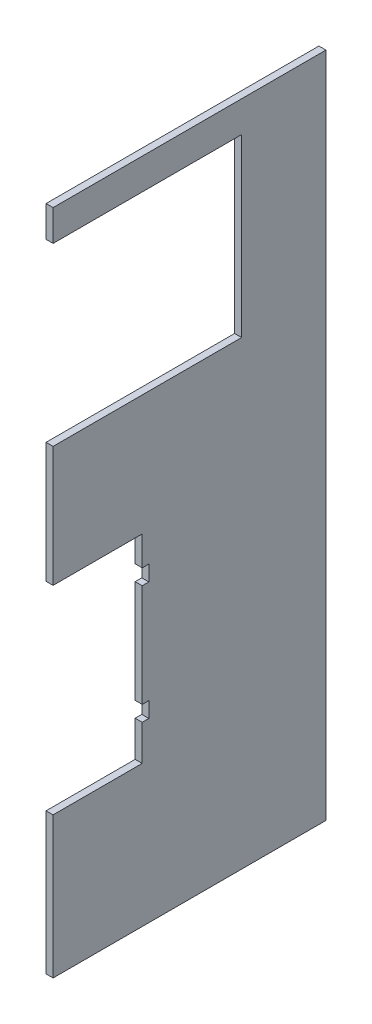
ISO-10303-21;
HEADER;
FILE_DESCRIPTION(('STEP AP214'),'2;1');
FILE_NAME('part.step','',(''),(''),'','','');
FILE_SCHEMA(('AUTOMOTIVE_DESIGN { 1 0 10303 214 1 1 1 1 }'));
ENDSEC;
DATA;
#1=APPLICATION_CONTEXT('core data for automotive mechanical design processes');
#2=APPLICATION_PROTOCOL_DEFINITION('international standard','automotive_design',2000,#1);
#3=PRODUCT_CONTEXT('',#1,'mechanical');
#4=PRODUCT('Part','Part','',(#3));
#5=PRODUCT_RELATED_PRODUCT_CATEGORY('part','',(#4));
#6=PRODUCT_DEFINITION_FORMATION('','',#4);
#7=PRODUCT_DEFINITION_CONTEXT('part definition',#1,'design');
#8=PRODUCT_DEFINITION('design','',#6,#7);
#9=PRODUCT_DEFINITION_SHAPE('','',#8);
#10=(LENGTH_UNIT() NAMED_UNIT(*) SI_UNIT(.MILLI.,.METRE.));
#11=(NAMED_UNIT(*) PLANE_ANGLE_UNIT() SI_UNIT($,.RADIAN.));
#12=(NAMED_UNIT(*) SI_UNIT($,.STERADIAN.) SOLID_ANGLE_UNIT());
#13=UNCERTAINTY_MEASURE_WITH_UNIT(LENGTH_MEASURE(1.E-05),#10,'distance_accuracy_value','');
#14=(GEOMETRIC_REPRESENTATION_CONTEXT(3) GLOBAL_UNCERTAINTY_ASSIGNED_CONTEXT((#13)) GLOBAL_UNIT_ASSIGNED_CONTEXT((#10,
#11,#12)) REPRESENTATION_CONTEXT('',''));
#15=CARTESIAN_POINT('',(0.,0.,0.));
#16=DIRECTION('',(0.,0.,1.));
#17=DIRECTION('',(1.,0.,0.));
#18=AXIS2_PLACEMENT_3D('',#15,#16,#17);
#19=CARTESIAN_POINT('',(1.,5.85000000000012,42.25));
#20=DIRECTION('',(0.,0.,1.));
#21=DIRECTION('',(0.,-1.,0.));
#22=AXIS2_PLACEMENT_3D('',#19,#20,#21);
#23=PLANE('',#22);
#24=DIRECTION('',(1.,0.,0.));
#25=VECTOR('',#24,1.);
#26=CARTESIAN_POINT('',(1.,25.9691599433872,42.25));
#27=LINE('',#26,#25);
#28=CARTESIAN_POINT('',(0.,25.9691599433872,42.25));
#29=VERTEX_POINT('',#28);
#30=CARTESIAN_POINT('',(1.,25.9691599433872,42.25));
#31=VERTEX_POINT('',#30);
#32=EDGE_CURVE('E283',#29,#31,#27,.T.);
#33=ORIENTED_EDGE('',*,*,#32,.F.);
#34=DIRECTION('',(0.,1.,0.));
#35=VECTOR('',#34,1.);
#36=CARTESIAN_POINT('',(0.,100.85,42.25));
#37=LINE('',#36,#35);
#38=CARTESIAN_POINT('',(0.,5.85000000000012,42.25));
#39=VERTEX_POINT('',#38);
#40=EDGE_CURVE('E286',#39,#29,#37,.T.);
#41=ORIENTED_EDGE('',*,*,#40,.F.);
#42=DIRECTION('',(-1.,0.,0.));
#43=VECTOR('',#42,1.);
#44=CARTESIAN_POINT('',(1.,5.85000000000012,42.25));
#45=LINE('',#44,#43);
#46=CARTESIAN_POINT('',(1.,5.85000000000012,42.25));
#47=VERTEX_POINT('',#46);
#48=EDGE_CURVE('E312',#47,#39,#45,.T.);
#49=ORIENTED_EDGE('',*,*,#48,.F.);
#50=DIRECTION('',(0.,1.,0.));
#51=VECTOR('',#50,1.);
#52=CARTESIAN_POINT('',(1.,5.85000000000012,42.25));
#53=LINE('',#52,#51);
#54=EDGE_CURVE('E303',#47,#31,#53,.T.);
#55=ORIENTED_EDGE('',*,*,#54,.T.);
#56=EDGE_LOOP('',(#33,#41,#49,#55));
#57=FACE_BOUND('',#56,.T.);
#58=ADVANCED_FACE('F32',(#57),#23,.T.);
#59=DIRECTION('',(-1.,0.,0.));
#60=VECTOR('',#59,1.);
#61=CARTESIAN_POINT('',(1.,54.2619783963912,42.25));
#62=LINE('',#61,#60);
#63=CARTESIAN_POINT('',(1.,54.2619783963912,42.25));
#64=VERTEX_POINT('',#63);
#65=CARTESIAN_POINT('',(0.,54.2619783963912,42.25));
#66=VERTEX_POINT('',#65);
#67=EDGE_CURVE('E55',#64,#66,#62,.T.);
#68=ORIENTED_EDGE('',*,*,#67,.F.);
#69=CARTESIAN_POINT('',(1.,71.4049337537653,42.25));
#70=VERTEX_POINT('',#69);
#71=EDGE_CURVE('E190',#64,#70,#53,.T.);
#72=ORIENTED_EDGE('',*,*,#71,.T.);
#73=DIRECTION('',(1.,0.,0.));
#74=VECTOR('',#73,1.);
#75=CARTESIAN_POINT('',(1.,71.4049337537653,42.25));
#76=LINE('',#75,#74);
#77=CARTESIAN_POINT('',(0.,71.4049337537653,42.25));
#78=VERTEX_POINT('',#77);
#79=EDGE_CURVE('E280',#78,#70,#76,.T.);
#80=ORIENTED_EDGE('',*,*,#79,.F.);
#81=EDGE_CURVE('E290',#66,#78,#37,.T.);
#82=ORIENTED_EDGE('',*,*,#81,.F.);
#83=EDGE_LOOP('',(#68,#72,#80,#82));
#84=FACE_BOUND('',#83,.T.);
#85=ADVANCED_FACE('F334',(#84),#23,.T.);
#86=CARTESIAN_POINT('',(1.,5.85000000000011,3.40000000000003));
#87=DIRECTION('',(0.,-1.,0.));
#88=DIRECTION('',(0.,0.,-1.));
#89=AXIS2_PLACEMENT_3D('',#86,#87,#88);
#90=PLANE('',#89);
#91=ORIENTED_EDGE('',*,*,#48,.T.);
#92=DIRECTION('',(0.,0.,1.));
#93=VECTOR('',#92,1.);
#94=CARTESIAN_POINT('',(0.,5.85000000000012,42.25));
#95=LINE('',#94,#93);
#96=CARTESIAN_POINT('',(0.,5.85000000000011,3.40000000000002));
#97=VERTEX_POINT('',#96);
#98=EDGE_CURVE('E296',#97,#39,#95,.T.);
#99=ORIENTED_EDGE('',*,*,#98,.F.);
#100=DIRECTION('',(-1.,0.,0.));
#101=VECTOR('',#100,1.);
#102=CARTESIAN_POINT('',(1.,5.85000000000011,3.40000000000003));
#103=LINE('',#102,#101);
#104=CARTESIAN_POINT('',(1.,5.85000000000011,3.40000000000003));
#105=VERTEX_POINT('',#104);
#106=EDGE_CURVE('E313',#105,#97,#103,.T.);
#107=ORIENTED_EDGE('',*,*,#106,.F.);
#108=DIRECTION('',(0.,0.,1.));
#109=VECTOR('',#108,1.);
#110=CARTESIAN_POINT('',(1.,5.85000000000011,3.40000000000003));
#111=LINE('',#110,#109);
#112=EDGE_CURVE('E299',#105,#47,#111,.T.);
#113=ORIENTED_EDGE('',*,*,#112,.T.);
#114=EDGE_LOOP('',(#91,#99,#107,#113));
#115=FACE_BOUND('',#114,.T.);
#116=ADVANCED_FACE('F34',(#115),#90,.T.);
#117=CARTESIAN_POINT('',(1.,100.85,3.40000000000002));
#118=DIRECTION('',(0.,0.,-1.));
#119=DIRECTION('',(0.,1.,0.));
#120=AXIS2_PLACEMENT_3D('',#117,#118,#119);
#121=PLANE('',#120);
#122=ORIENTED_EDGE('',*,*,#106,.T.);
#123=DIRECTION('',(0.,-1.,0.));
#124=VECTOR('',#123,1.);
#125=CARTESIAN_POINT('',(0.,5.85000000000011,3.40000000000002));
#126=LINE('',#125,#124);
#127=CARTESIAN_POINT('',(0.,100.85,3.40000000000002));
#128=VERTEX_POINT('',#127);
#129=EDGE_CURVE('E293',#128,#97,#126,.T.);
#130=ORIENTED_EDGE('',*,*,#129,.F.);
#131=DIRECTION('',(-1.,0.,0.));
#132=VECTOR('',#131,1.);
#133=CARTESIAN_POINT('',(1.,100.85,3.40000000000002));
#134=LINE('',#133,#132);
#135=CARTESIAN_POINT('',(1.,100.85,3.40000000000002));
#136=VERTEX_POINT('',#135);
#137=EDGE_CURVE('E315',#136,#128,#134,.T.);
#138=ORIENTED_EDGE('',*,*,#137,.F.);
#139=DIRECTION('',(0.,-1.,0.));
#140=VECTOR('',#139,1.);
#141=CARTESIAN_POINT('',(1.,100.85,3.40000000000002));
#142=LINE('',#141,#140);
#143=EDGE_CURVE('E309',#136,#105,#142,.T.);
#144=ORIENTED_EDGE('',*,*,#143,.T.);
#145=EDGE_LOOP('',(#122,#130,#138,#144));
#146=FACE_BOUND('',#145,.T.);
#147=ADVANCED_FACE('F368',(#146),#121,.T.);
#148=CARTESIAN_POINT('',(1.,100.85,42.25));
#149=DIRECTION('',(0.,1.,0.));
#150=DIRECTION('',(0.,0.,1.));
#151=AXIS2_PLACEMENT_3D('',#148,#149,#150);
#152=PLANE('',#151);
#153=ORIENTED_EDGE('',*,*,#137,.T.);
#154=DIRECTION('',(0.,0.,-1.));
#155=VECTOR('',#154,1.);
#156=CARTESIAN_POINT('',(0.,100.85,3.40000000000002));
#157=LINE('',#156,#155);
#158=CARTESIAN_POINT('',(0.,100.85,42.25));
#159=VERTEX_POINT('',#158);
#160=EDGE_CURVE('E289',#159,#128,#157,.T.);
#161=ORIENTED_EDGE('',*,*,#160,.F.);
#162=DIRECTION('',(-1.,0.,0.));
#163=VECTOR('',#162,1.);
#164=CARTESIAN_POINT('',(1.,100.85,42.25));
#165=LINE('',#164,#163);
#166=CARTESIAN_POINT('',(1.,100.85,42.25));
#167=VERTEX_POINT('',#166);
#168=EDGE_CURVE('E317',#167,#159,#165,.T.);
#169=ORIENTED_EDGE('',*,*,#168,.F.);
#170=DIRECTION('',(0.,0.,-1.));
#171=VECTOR('',#170,1.);
#172=CARTESIAN_POINT('',(1.,100.85,42.25));
#173=LINE('',#172,#171);
#174=EDGE_CURVE('E306',#167,#136,#173,.T.);
#175=ORIENTED_EDGE('',*,*,#174,.T.);
#176=EDGE_LOOP('',(#153,#161,#169,#175));
#177=FACE_BOUND('',#176,.T.);
#178=ADVANCED_FACE('F362',(#177),#152,.T.);
#179=DIRECTION('',(-1.,0.,0.));
#180=VECTOR('',#179,1.);
#181=CARTESIAN_POINT('',(1.,96.4291750070029,42.25));
#182=LINE('',#181,#180);
#183=CARTESIAN_POINT('',(1.,96.4291750070029,42.25));
#184=VERTEX_POINT('',#183);
#185=CARTESIAN_POINT('',(0.,96.4291750070028,42.25));
#186=VERTEX_POINT('',#185);
#187=EDGE_CURVE('E47',#184,#186,#182,.T.);
#188=ORIENTED_EDGE('',*,*,#187,.F.);
#189=EDGE_CURVE('E302',#184,#167,#53,.T.);
#190=ORIENTED_EDGE('',*,*,#189,.T.);
#191=ORIENTED_EDGE('',*,*,#168,.T.);
#192=EDGE_CURVE('E285',#186,#159,#37,.T.);
#193=ORIENTED_EDGE('',*,*,#192,.F.);
#194=EDGE_LOOP('',(#188,#190,#191,#193));
#195=FACE_BOUND('',#194,.T.);
#196=ADVANCED_FACE('F326',(#195),#23,.T.);
#197=CARTESIAN_POINT('',(1.,0.,0.));
#198=DIRECTION('',(-1.,0.,0.));
#199=DIRECTION('',(0.,0.,1.));
#200=AXIS2_PLACEMENT_3D('',#197,#198,#199);
#201=PLANE('',#200);
#202=DIRECTION('',(0.,-1.,0.));
#203=VECTOR('',#202,1.);
#204=CARTESIAN_POINT('',(1.,31.0387265210751,29.5622880308028));
#205=LINE('',#204,#203);
#206=CARTESIAN_POINT('',(1.,31.0387265210751,29.5622880308028));
#207=VERTEX_POINT('',#206);
#208=CARTESIAN_POINT('',(1.,25.9691599433872,29.5622880308028));
#209=VERTEX_POINT('',#208);
#210=EDGE_CURVE('E215',#207,#209,#205,.T.);
#211=ORIENTED_EDGE('',*,*,#210,.T.);
#212=DIRECTION('',(0.,0.,1.));
#213=VECTOR('',#212,1.);
#214=CARTESIAN_POINT('',(1.,25.9691599433872,47.1871750149511));
#215=LINE('',#214,#213);
#216=EDGE_CURVE('E175',#209,#31,#215,.T.);
#217=ORIENTED_EDGE('',*,*,#216,.T.);
#218=ORIENTED_EDGE('',*,*,#54,.F.);
#219=ORIENTED_EDGE('',*,*,#112,.F.);
#220=ORIENTED_EDGE('',*,*,#143,.F.);
#221=ORIENTED_EDGE('',*,*,#174,.F.);
#222=ORIENTED_EDGE('',*,*,#189,.F.);
#223=DIRECTION('',(0.,0.,-1.));
#224=VECTOR('',#223,1.);
#225=CARTESIAN_POINT('',(1.,96.4291750070029,44.6086966374563));
#226=LINE('',#225,#224);
#227=CARTESIAN_POINT('',(1.,96.4291750070028,15.406297721991));
#228=VERTEX_POINT('',#227);
#229=EDGE_CURVE('E262',#184,#228,#226,.T.);
#230=ORIENTED_EDGE('',*,*,#229,.T.);
#231=DIRECTION('',(0.,-1.,0.));
#232=VECTOR('',#231,1.);
#233=CARTESIAN_POINT('',(1.,96.4291750070028,15.406297721991));
#234=LINE('',#233,#232);
#235=CARTESIAN_POINT('',(1.,71.4049337537653,15.406297721991));
#236=VERTEX_POINT('',#235);
#237=EDGE_CURVE('E265',#228,#236,#234,.T.);
#238=ORIENTED_EDGE('',*,*,#237,.T.);
#239=DIRECTION('',(0.,0.,1.));
#240=VECTOR('',#239,1.);
#241=CARTESIAN_POINT('',(1.,71.4049337537653,44.6086966374563));
#242=LINE('',#241,#240);
#243=EDGE_CURVE('E269',#236,#70,#242,.T.);
#244=ORIENTED_EDGE('',*,*,#243,.T.);
#245=ORIENTED_EDGE('',*,*,#71,.F.);
#246=DIRECTION('',(0.,0.,-1.));
#247=VECTOR('',#246,1.);
#248=CARTESIAN_POINT('',(1.,54.2619783963912,47.1871750149511));
#249=LINE('',#248,#247);
#250=CARTESIAN_POINT('',(1.,54.2619783963912,29.5622880308028));
#251=VERTEX_POINT('',#250);
#252=EDGE_CURVE('E170',#64,#251,#249,.T.);
#253=ORIENTED_EDGE('',*,*,#252,.T.);
#254=DIRECTION('',(0.,-1.,0.));
#255=VECTOR('',#254,1.);
#256=CARTESIAN_POINT('',(1.,54.2619783963912,29.5622880308028));
#257=LINE('',#256,#255);
#258=CARTESIAN_POINT('',(1.,50.0787265210751,29.5622880308028));
#259=VERTEX_POINT('',#258);
#260=EDGE_CURVE('E178',#251,#259,#257,.T.);
#261=ORIENTED_EDGE('',*,*,#260,.T.);
#262=DIRECTION('',(0.,0.,-1.));
#263=VECTOR('',#262,1.);
#264=CARTESIAN_POINT('',(1.,50.0787265210751,29.5622880308028));
#265=LINE('',#264,#263);
#266=CARTESIAN_POINT('',(1.,50.0787265210751,28.6188892282582));
#267=VERTEX_POINT('',#266);
#268=EDGE_CURVE('E183',#259,#267,#265,.T.);
#269=ORIENTED_EDGE('',*,*,#268,.T.);
#270=DIRECTION('',(0.,-1.,0.));
#271=VECTOR('',#270,1.);
#272=CARTESIAN_POINT('',(1.,50.0787265210751,28.6188892282582));
#273=LINE('',#272,#271);
#274=CARTESIAN_POINT('',(1.,47.8787265210751,28.6188892282582));
#275=VERTEX_POINT('',#274);
#276=EDGE_CURVE('E197',#267,#275,#273,.T.);
#277=ORIENTED_EDGE('',*,*,#276,.T.);
#278=DIRECTION('',(0.,0.,1.));
#279=VECTOR('',#278,1.);
#280=CARTESIAN_POINT('',(1.,47.8787265210751,28.6188892282582));
#281=LINE('',#280,#279);
#282=CARTESIAN_POINT('',(1.,47.8787265210751,29.5622880308028));
#283=VERTEX_POINT('',#282);
#284=EDGE_CURVE('E200',#275,#283,#281,.T.);
#285=ORIENTED_EDGE('',*,*,#284,.T.);
#286=DIRECTION('',(0.,-1.,0.));
#287=VECTOR('',#286,1.);
#288=CARTESIAN_POINT('',(1.,47.8787265210751,29.5622880308028));
#289=LINE('',#288,#287);
#290=CARTESIAN_POINT('',(1.,33.2387265210751,29.5622880308028));
#291=VERTEX_POINT('',#290);
#292=EDGE_CURVE('E203',#283,#291,#289,.T.);
#293=ORIENTED_EDGE('',*,*,#292,.T.);
#294=DIRECTION('',(0.,0.,-1.));
#295=VECTOR('',#294,1.);
#296=CARTESIAN_POINT('',(1.,33.2387265210751,29.5622880308028));
#297=LINE('',#296,#295);
#298=CARTESIAN_POINT('',(1.,33.2387265210751,28.6188892282582));
#299=VERTEX_POINT('',#298);
#300=EDGE_CURVE('E206',#291,#299,#297,.T.);
#301=ORIENTED_EDGE('',*,*,#300,.T.);
#302=DIRECTION('',(0.,-1.,0.));
#303=VECTOR('',#302,1.);
#304=CARTESIAN_POINT('',(1.,33.2387265210751,28.6188892282582));
#305=LINE('',#304,#303);
#306=CARTESIAN_POINT('',(1.,31.0387265210751,28.6188892282582));
#307=VERTEX_POINT('',#306);
#308=EDGE_CURVE('E209',#299,#307,#305,.T.);
#309=ORIENTED_EDGE('',*,*,#308,.T.);
#310=DIRECTION('',(0.,0.,1.));
#311=VECTOR('',#310,1.);
#312=CARTESIAN_POINT('',(1.,31.0387265210751,28.6188892282582));
#313=LINE('',#312,#311);
#314=EDGE_CURVE('E212',#307,#207,#313,.T.);
#315=ORIENTED_EDGE('',*,*,#314,.T.);
#316=EDGE_LOOP('',(#211,#217,#218,#219,#220,#221,#222,#230,#238,#244,#245,#253,#261,#269,#277,
#285,#293,#301,#309,#315));
#317=FACE_BOUND('',#316,.T.);
#318=ADVANCED_FACE('F187',(#317),#201,.F.);
#319=CARTESIAN_POINT('',(0.,0.,0.));
#320=DIRECTION('',(1.,0.,0.));
#321=DIRECTION('',(0.,0.,-1.));
#322=AXIS2_PLACEMENT_3D('',#319,#320,#321);
#323=PLANE('',#322);
#324=ORIENTED_EDGE('',*,*,#40,.T.);
#325=DIRECTION('',(0.,0.,1.));
#326=VECTOR('',#325,1.);
#327=CARTESIAN_POINT('',(0.,25.9691599433872,47.1871750149511));
#328=LINE('',#327,#326);
#329=CARTESIAN_POINT('',(0.,25.9691599433872,29.5622880308028));
#330=VERTEX_POINT('',#329);
#331=EDGE_CURVE('E191',#330,#29,#328,.T.);
#332=ORIENTED_EDGE('',*,*,#331,.F.);
#333=DIRECTION('',(0.,-1.,0.));
#334=VECTOR('',#333,1.);
#335=CARTESIAN_POINT('',(0.,31.0387265210751,29.5622880308028));
#336=LINE('',#335,#334);
#337=CARTESIAN_POINT('',(0.,31.0387265210751,29.5622880308028));
#338=VERTEX_POINT('',#337);
#339=EDGE_CURVE('E193',#338,#330,#336,.T.);
#340=ORIENTED_EDGE('',*,*,#339,.F.);
#341=DIRECTION('',(0.,0.,1.));
#342=VECTOR('',#341,1.);
#343=CARTESIAN_POINT('',(0.,31.0387265210751,28.6188892282582));
#344=LINE('',#343,#342);
#345=CARTESIAN_POINT('',(0.,31.0387265210751,28.6188892282582));
#346=VERTEX_POINT('',#345);
#347=EDGE_CURVE('E240',#346,#338,#344,.T.);
#348=ORIENTED_EDGE('',*,*,#347,.F.);
#349=DIRECTION('',(0.,-1.,0.));
#350=VECTOR('',#349,1.);
#351=CARTESIAN_POINT('',(0.,33.2387265210751,28.6188892282582));
#352=LINE('',#351,#350);
#353=CARTESIAN_POINT('',(0.,33.2387265210751,28.6188892282582));
#354=VERTEX_POINT('',#353);
#355=EDGE_CURVE('E237',#354,#346,#352,.T.);
#356=ORIENTED_EDGE('',*,*,#355,.F.);
#357=DIRECTION('',(0.,0.,-1.));
#358=VECTOR('',#357,1.);
#359=CARTESIAN_POINT('',(0.,33.2387265210751,29.5622880308028));
#360=LINE('',#359,#358);
#361=CARTESIAN_POINT('',(0.,33.2387265210751,29.5622880308028));
#362=VERTEX_POINT('',#361);
#363=EDGE_CURVE('E234',#362,#354,#360,.T.);
#364=ORIENTED_EDGE('',*,*,#363,.F.);
#365=DIRECTION('',(0.,-1.,0.));
#366=VECTOR('',#365,1.);
#367=CARTESIAN_POINT('',(0.,47.8787265210751,29.5622880308028));
#368=LINE('',#367,#366);
#369=CARTESIAN_POINT('',(0.,47.8787265210751,29.5622880308028));
#370=VERTEX_POINT('',#369);
#371=EDGE_CURVE('E231',#370,#362,#368,.T.);
#372=ORIENTED_EDGE('',*,*,#371,.F.);
#373=DIRECTION('',(0.,0.,1.));
#374=VECTOR('',#373,1.);
#375=CARTESIAN_POINT('',(0.,47.8787265210751,28.6188892282582));
#376=LINE('',#375,#374);
#377=CARTESIAN_POINT('',(0.,47.8787265210751,28.6188892282582));
#378=VERTEX_POINT('',#377);
#379=EDGE_CURVE('E228',#378,#370,#376,.T.);
#380=ORIENTED_EDGE('',*,*,#379,.F.);
#381=DIRECTION('',(0.,-1.,0.));
#382=VECTOR('',#381,1.);
#383=CARTESIAN_POINT('',(0.,50.0787265210751,28.6188892282582));
#384=LINE('',#383,#382);
#385=CARTESIAN_POINT('',(0.,50.0787265210751,28.6188892282582));
#386=VERTEX_POINT('',#385);
#387=EDGE_CURVE('E225',#386,#378,#384,.T.);
#388=ORIENTED_EDGE('',*,*,#387,.F.);
#389=DIRECTION('',(0.,0.,-1.));
#390=VECTOR('',#389,1.);
#391=CARTESIAN_POINT('',(0.,50.0787265210751,29.5622880308028));
#392=LINE('',#391,#390);
#393=CARTESIAN_POINT('',(0.,50.0787265210751,29.5622880308028));
#394=VERTEX_POINT('',#393);
#395=EDGE_CURVE('E221',#394,#386,#392,.T.);
#396=ORIENTED_EDGE('',*,*,#395,.F.);
#397=DIRECTION('',(0.,-1.,0.));
#398=VECTOR('',#397,1.);
#399=CARTESIAN_POINT('',(0.,54.2619783963912,29.5622880308028));
#400=LINE('',#399,#398);
#401=CARTESIAN_POINT('',(0.,54.2619783963912,29.5622880308028));
#402=VERTEX_POINT('',#401);
#403=EDGE_CURVE('E219',#402,#394,#400,.T.);
#404=ORIENTED_EDGE('',*,*,#403,.F.);
#405=DIRECTION('',(0.,0.,1.));
#406=VECTOR('',#405,1.);
#407=CARTESIAN_POINT('',(0.,54.2619783963912,0.));
#408=LINE('',#407,#406);
#409=EDGE_CURVE('E11',#402,#66,#408,.T.);
#410=ORIENTED_EDGE('',*,*,#409,.T.);
#411=ORIENTED_EDGE('',*,*,#81,.T.);
#412=DIRECTION('',(0.,0.,1.));
#413=VECTOR('',#412,1.);
#414=CARTESIAN_POINT('',(0.,71.4049337537653,44.6086966374563));
#415=LINE('',#414,#413);
#416=CARTESIAN_POINT('',(0.,71.4049337537653,15.406297721991));
#417=VERTEX_POINT('',#416);
#418=EDGE_CURVE('E266',#417,#78,#415,.T.);
#419=ORIENTED_EDGE('',*,*,#418,.F.);
#420=DIRECTION('',(0.,-1.,0.));
#421=VECTOR('',#420,1.);
#422=CARTESIAN_POINT('',(0.,96.4291750070028,15.406297721991));
#423=LINE('',#422,#421);
#424=CARTESIAN_POINT('',(0.,96.4291750070028,15.406297721991));
#425=VERTEX_POINT('',#424);
#426=EDGE_CURVE('E272',#425,#417,#423,.T.);
#427=ORIENTED_EDGE('',*,*,#426,.F.);
#428=DIRECTION('',(0.,0.,1.));
#429=VECTOR('',#428,1.);
#430=CARTESIAN_POINT('',(0.,96.4291750070028,0.));
#431=LINE('',#430,#429);
#432=EDGE_CURVE('E40',#425,#186,#431,.T.);
#433=ORIENTED_EDGE('',*,*,#432,.T.);
#434=ORIENTED_EDGE('',*,*,#192,.T.);
#435=ORIENTED_EDGE('',*,*,#160,.T.);
#436=ORIENTED_EDGE('',*,*,#129,.T.);
#437=ORIENTED_EDGE('',*,*,#98,.T.);
#438=EDGE_LOOP('',(#324,#332,#340,#348,#356,#364,#372,#380,#388,#396,#404,#410,#411,#419,#427,
#433,#434,#435,#436,#437));
#439=FACE_BOUND('',#438,.T.);
#440=ADVANCED_FACE('F323',(#439),#323,.F.);
#441=CARTESIAN_POINT('',(1.,71.4049337537653,44.6086966374563));
#442=DIRECTION('',(0.,-1.,0.));
#443=DIRECTION('',(0.,0.,-1.));
#444=AXIS2_PLACEMENT_3D('',#441,#442,#443);
#445=PLANE('',#444);
#446=ORIENTED_EDGE('',*,*,#79,.T.);
#447=ORIENTED_EDGE('',*,*,#243,.F.);
#448=DIRECTION('',(-1.,0.,0.));
#449=VECTOR('',#448,1.);
#450=CARTESIAN_POINT('',(1.,71.4049337537653,15.406297721991));
#451=LINE('',#450,#449);
#452=EDGE_CURVE('E222',#236,#417,#451,.T.);
#453=ORIENTED_EDGE('',*,*,#452,.T.);
#454=ORIENTED_EDGE('',*,*,#418,.T.);
#455=EDGE_LOOP('',(#446,#447,#453,#454));
#456=FACE_BOUND('',#455,.T.);
#457=ADVANCED_FACE('F337',(#456),#445,.F.);
#458=CARTESIAN_POINT('',(1.,96.4291750070028,15.406297721991));
#459=DIRECTION('',(0.,0.,-1.));
#460=DIRECTION('',(0.,1.,0.));
#461=AXIS2_PLACEMENT_3D('',#458,#459,#460);
#462=PLANE('',#461);
#463=ORIENTED_EDGE('',*,*,#426,.T.);
#464=ORIENTED_EDGE('',*,*,#452,.F.);
#465=ORIENTED_EDGE('',*,*,#237,.F.);
#466=DIRECTION('',(-1.,0.,0.));
#467=VECTOR('',#466,1.);
#468=CARTESIAN_POINT('',(1.,96.4291750070028,15.406297721991));
#469=LINE('',#468,#467);
#470=EDGE_CURVE('E271',#228,#425,#469,.T.);
#471=ORIENTED_EDGE('',*,*,#470,.T.);
#472=EDGE_LOOP('',(#463,#464,#465,#471));
#473=FACE_BOUND('',#472,.T.);
#474=ADVANCED_FACE('F340',(#473),#462,.F.);
#475=CARTESIAN_POINT('',(1.,96.4291750070029,44.6086966374563));
#476=DIRECTION('',(0.,1.,0.));
#477=DIRECTION('',(0.,0.,1.));
#478=AXIS2_PLACEMENT_3D('',#475,#476,#477);
#479=PLANE('',#478);
#480=ORIENTED_EDGE('',*,*,#187,.T.);
#481=ORIENTED_EDGE('',*,*,#432,.F.);
#482=ORIENTED_EDGE('',*,*,#470,.F.);
#483=ORIENTED_EDGE('',*,*,#229,.F.);
#484=EDGE_LOOP('',(#480,#481,#482,#483));
#485=FACE_BOUND('',#484,.T.);
#486=ADVANCED_FACE('F341',(#485),#479,.F.);
#487=CARTESIAN_POINT('',(1.,25.9691599433872,47.1871750149511));
#488=DIRECTION('',(0.,-1.,0.));
#489=DIRECTION('',(0.,0.,-1.));
#490=AXIS2_PLACEMENT_3D('',#487,#488,#489);
#491=PLANE('',#490);
#492=ORIENTED_EDGE('',*,*,#32,.T.);
#493=ORIENTED_EDGE('',*,*,#216,.F.);
#494=DIRECTION('',(-1.,0.,0.));
#495=VECTOR('',#494,1.);
#496=CARTESIAN_POINT('',(1.,25.9691599433872,29.5622880308028));
#497=LINE('',#496,#495);
#498=EDGE_CURVE('E245',#209,#330,#497,.T.);
#499=ORIENTED_EDGE('',*,*,#498,.T.);
#500=ORIENTED_EDGE('',*,*,#331,.T.);
#501=EDGE_LOOP('',(#492,#493,#499,#500));
#502=FACE_BOUND('',#501,.T.);
#503=ADVANCED_FACE('F343',(#502),#491,.F.);
#504=CARTESIAN_POINT('',(1.,31.0387265210751,29.5622880308028));
#505=DIRECTION('',(0.,0.,-1.));
#506=DIRECTION('',(-1.,0.,0.));
#507=AXIS2_PLACEMENT_3D('',#504,#505,#506);
#508=PLANE('',#507);
#509=ORIENTED_EDGE('',*,*,#339,.T.);
#510=ORIENTED_EDGE('',*,*,#498,.F.);
#511=ORIENTED_EDGE('',*,*,#210,.F.);
#512=DIRECTION('',(-1.,0.,0.));
#513=VECTOR('',#512,1.);
#514=CARTESIAN_POINT('',(1.,31.0387265210751,29.5622880308028));
#515=LINE('',#514,#513);
#516=EDGE_CURVE('E247',#207,#338,#515,.T.);
#517=ORIENTED_EDGE('',*,*,#516,.T.);
#518=EDGE_LOOP('',(#509,#510,#511,#517));
#519=FACE_BOUND('',#518,.T.);
#520=ADVANCED_FACE('F349',(#519),#508,.F.);
#521=CARTESIAN_POINT('',(1.,31.0387265210751,28.6188892282582));
#522=DIRECTION('',(0.,-1.,0.));
#523=DIRECTION('',(0.,0.,-1.));
#524=AXIS2_PLACEMENT_3D('',#521,#522,#523);
#525=PLANE('',#524);
#526=ORIENTED_EDGE('',*,*,#347,.T.);
#527=ORIENTED_EDGE('',*,*,#516,.F.);
#528=ORIENTED_EDGE('',*,*,#314,.F.);
#529=DIRECTION('',(-1.,0.,0.));
#530=VECTOR('',#529,1.);
#531=CARTESIAN_POINT('',(1.,31.0387265210751,28.6188892282582));
#532=LINE('',#531,#530);
#533=EDGE_CURVE('E249',#307,#346,#532,.T.);
#534=ORIENTED_EDGE('',*,*,#533,.T.);
#535=EDGE_LOOP('',(#526,#527,#528,#534));
#536=FACE_BOUND('',#535,.T.);
#537=ADVANCED_FACE('F410',(#536),#525,.F.);
#538=CARTESIAN_POINT('',(1.,33.2387265210751,28.6188892282582));
#539=DIRECTION('',(0.,0.,-1.));
#540=DIRECTION('',(-1.,0.,0.));
#541=AXIS2_PLACEMENT_3D('',#538,#539,#540);
#542=PLANE('',#541);
#543=ORIENTED_EDGE('',*,*,#355,.T.);
#544=ORIENTED_EDGE('',*,*,#533,.F.);
#545=ORIENTED_EDGE('',*,*,#308,.F.);
#546=DIRECTION('',(-1.,0.,0.));
#547=VECTOR('',#546,1.);
#548=CARTESIAN_POINT('',(1.,33.2387265210751,28.6188892282582));
#549=LINE('',#548,#547);
#550=EDGE_CURVE('E251',#299,#354,#549,.T.);
#551=ORIENTED_EDGE('',*,*,#550,.T.);
#552=EDGE_LOOP('',(#543,#544,#545,#551));
#553=FACE_BOUND('',#552,.T.);
#554=ADVANCED_FACE('F406',(#553),#542,.F.);
#555=CARTESIAN_POINT('',(1.,33.2387265210751,29.5622880308028));
#556=DIRECTION('',(0.,1.,0.));
#557=DIRECTION('',(0.,0.,1.));
#558=AXIS2_PLACEMENT_3D('',#555,#556,#557);
#559=PLANE('',#558);
#560=ORIENTED_EDGE('',*,*,#363,.T.);
#561=ORIENTED_EDGE('',*,*,#550,.F.);
#562=ORIENTED_EDGE('',*,*,#300,.F.);
#563=DIRECTION('',(-1.,0.,0.));
#564=VECTOR('',#563,1.);
#565=CARTESIAN_POINT('',(1.,33.2387265210751,29.5622880308028));
#566=LINE('',#565,#564);
#567=EDGE_CURVE('E253',#291,#362,#566,.T.);
#568=ORIENTED_EDGE('',*,*,#567,.T.);
#569=EDGE_LOOP('',(#560,#561,#562,#568));
#570=FACE_BOUND('',#569,.T.);
#571=ADVANCED_FACE('F402',(#570),#559,.F.);
#572=CARTESIAN_POINT('',(1.,47.8787265210751,29.5622880308028));
#573=DIRECTION('',(0.,0.,-1.));
#574=DIRECTION('',(0.,1.,0.));
#575=AXIS2_PLACEMENT_3D('',#572,#573,#574);
#576=PLANE('',#575);
#577=ORIENTED_EDGE('',*,*,#371,.T.);
#578=ORIENTED_EDGE('',*,*,#567,.F.);
#579=ORIENTED_EDGE('',*,*,#292,.F.);
#580=DIRECTION('',(-1.,0.,0.));
#581=VECTOR('',#580,1.);
#582=CARTESIAN_POINT('',(1.,47.8787265210751,29.5622880308028));
#583=LINE('',#582,#581);
#584=EDGE_CURVE('E255',#283,#370,#583,.T.);
#585=ORIENTED_EDGE('',*,*,#584,.T.);
#586=EDGE_LOOP('',(#577,#578,#579,#585));
#587=FACE_BOUND('',#586,.T.);
#588=ADVANCED_FACE('F398',(#587),#576,.F.);
#589=CARTESIAN_POINT('',(1.,47.8787265210751,28.6188892282582));
#590=DIRECTION('',(0.,-1.,0.));
#591=DIRECTION('',(0.,0.,-1.));
#592=AXIS2_PLACEMENT_3D('',#589,#590,#591);
#593=PLANE('',#592);
#594=ORIENTED_EDGE('',*,*,#379,.T.);
#595=ORIENTED_EDGE('',*,*,#584,.F.);
#596=ORIENTED_EDGE('',*,*,#284,.F.);
#597=DIRECTION('',(-1.,0.,0.));
#598=VECTOR('',#597,1.);
#599=CARTESIAN_POINT('',(1.,47.8787265210751,28.6188892282582));
#600=LINE('',#599,#598);
#601=EDGE_CURVE('E257',#275,#378,#600,.T.);
#602=ORIENTED_EDGE('',*,*,#601,.T.);
#603=EDGE_LOOP('',(#594,#595,#596,#602));
#604=FACE_BOUND('',#603,.T.);
#605=ADVANCED_FACE('F394',(#604),#593,.F.);
#606=CARTESIAN_POINT('',(1.,50.0787265210751,28.6188892282582));
#607=DIRECTION('',(0.,0.,-1.));
#608=DIRECTION('',(-1.,0.,0.));
#609=AXIS2_PLACEMENT_3D('',#606,#607,#608);
#610=PLANE('',#609);
#611=ORIENTED_EDGE('',*,*,#387,.T.);
#612=ORIENTED_EDGE('',*,*,#601,.F.);
#613=ORIENTED_EDGE('',*,*,#276,.F.);
#614=DIRECTION('',(-1.,0.,0.));
#615=VECTOR('',#614,1.);
#616=CARTESIAN_POINT('',(1.,50.0787265210751,28.6188892282582));
#617=LINE('',#616,#615);
#618=EDGE_CURVE('E259',#267,#386,#617,.T.);
#619=ORIENTED_EDGE('',*,*,#618,.T.);
#620=EDGE_LOOP('',(#611,#612,#613,#619));
#621=FACE_BOUND('',#620,.T.);
#622=ADVANCED_FACE('F390',(#621),#610,.F.);
#623=CARTESIAN_POINT('',(1.,50.0787265210751,29.5622880308028));
#624=DIRECTION('',(0.,1.,0.));
#625=DIRECTION('',(0.,0.,1.));
#626=AXIS2_PLACEMENT_3D('',#623,#624,#625);
#627=PLANE('',#626);
#628=ORIENTED_EDGE('',*,*,#395,.T.);
#629=ORIENTED_EDGE('',*,*,#618,.F.);
#630=ORIENTED_EDGE('',*,*,#268,.F.);
#631=DIRECTION('',(-1.,0.,0.));
#632=VECTOR('',#631,1.);
#633=CARTESIAN_POINT('',(1.,50.0787265210751,29.5622880308028));
#634=LINE('',#633,#632);
#635=EDGE_CURVE('E174',#259,#394,#634,.T.);
#636=ORIENTED_EDGE('',*,*,#635,.T.);
#637=EDGE_LOOP('',(#628,#629,#630,#636));
#638=FACE_BOUND('',#637,.T.);
#639=ADVANCED_FACE('F387',(#638),#627,.F.);
#640=CARTESIAN_POINT('',(1.,54.2619783963912,29.5622880308028));
#641=DIRECTION('',(0.,0.,-1.));
#642=DIRECTION('',(-1.,0.,0.));
#643=AXIS2_PLACEMENT_3D('',#640,#641,#642);
#644=PLANE('',#643);
#645=ORIENTED_EDGE('',*,*,#403,.T.);
#646=ORIENTED_EDGE('',*,*,#635,.F.);
#647=ORIENTED_EDGE('',*,*,#260,.F.);
#648=DIRECTION('',(-1.,0.,0.));
#649=VECTOR('',#648,1.);
#650=CARTESIAN_POINT('',(1.,54.2619783963912,29.5622880308028));
#651=LINE('',#650,#649);
#652=EDGE_CURVE('E166',#251,#402,#651,.T.);
#653=ORIENTED_EDGE('',*,*,#652,.T.);
#654=EDGE_LOOP('',(#645,#646,#647,#653));
#655=FACE_BOUND('',#654,.T.);
#656=ADVANCED_FACE('F179',(#655),#644,.F.);
#657=CARTESIAN_POINT('',(1.,54.2619783963912,47.1871750149511));
#658=DIRECTION('',(0.,1.,0.));
#659=DIRECTION('',(0.,0.,1.));
#660=AXIS2_PLACEMENT_3D('',#657,#658,#659);
#661=PLANE('',#660);
#662=ORIENTED_EDGE('',*,*,#67,.T.);
#663=ORIENTED_EDGE('',*,*,#409,.F.);
#664=ORIENTED_EDGE('',*,*,#652,.F.);
#665=ORIENTED_EDGE('',*,*,#252,.F.);
#666=EDGE_LOOP('',(#662,#663,#664,#665));
#667=FACE_BOUND('',#666,.T.);
#668=ADVANCED_FACE('F168',(#667),#661,.F.);
#669=CLOSED_SHELL('',(#58,#85,#116,#147,#178,#196,#318,#440,#457,#474,#486,#503,#520,#537,#554,
#571,#588,#605,#622,#639,#656,#668));
#670=MANIFOLD_SOLID_BREP('B2',#669);
#671=ADVANCED_BREP_SHAPE_REPRESENTATION('',(#18,#670),#14);
#672=SHAPE_DEFINITION_REPRESENTATION(#9,#671);
ENDSEC;
END-ISO-10303-21;
